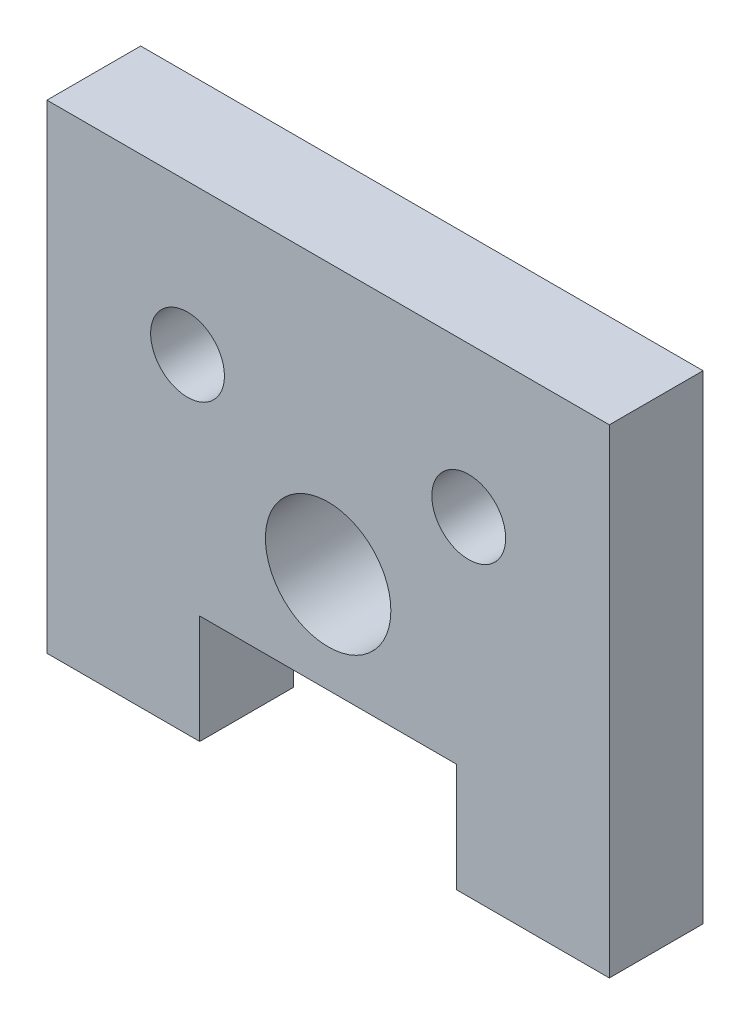
ISO-10303-21;
HEADER;
FILE_DESCRIPTION(('STEP AP214'),'2;1');
FILE_NAME('part.step','',(''),(''),'','','');
FILE_SCHEMA(('AUTOMOTIVE_DESIGN { 1 0 10303 214 1 1 1 1 }'));
ENDSEC;
DATA;
#1=APPLICATION_CONTEXT('core data for automotive mechanical design processes');
#2=APPLICATION_PROTOCOL_DEFINITION('international standard','automotive_design',2000,#1);
#3=PRODUCT_CONTEXT('',#1,'mechanical');
#4=PRODUCT('Part','Part','',(#3));
#5=PRODUCT_RELATED_PRODUCT_CATEGORY('part','',(#4));
#6=PRODUCT_DEFINITION_FORMATION('','',#4);
#7=PRODUCT_DEFINITION_CONTEXT('part definition',#1,'design');
#8=PRODUCT_DEFINITION('design','',#6,#7);
#9=PRODUCT_DEFINITION_SHAPE('','',#8);
#10=(LENGTH_UNIT() NAMED_UNIT(*) SI_UNIT(.MILLI.,.METRE.));
#11=(NAMED_UNIT(*) PLANE_ANGLE_UNIT() SI_UNIT($,.RADIAN.));
#12=(NAMED_UNIT(*) SI_UNIT($,.STERADIAN.) SOLID_ANGLE_UNIT());
#13=UNCERTAINTY_MEASURE_WITH_UNIT(LENGTH_MEASURE(1.E-05),#10,'distance_accuracy_value','');
#14=(GEOMETRIC_REPRESENTATION_CONTEXT(3) GLOBAL_UNCERTAINTY_ASSIGNED_CONTEXT((#13)) GLOBAL_UNIT_ASSIGNED_CONTEXT((#10,
#11,#12)) REPRESENTATION_CONTEXT('',''));
#15=CARTESIAN_POINT('',(0.,0.,0.));
#16=DIRECTION('',(0.,0.,1.));
#17=DIRECTION('',(1.,0.,0.));
#18=AXIS2_PLACEMENT_3D('',#15,#16,#17);
#19=CARTESIAN_POINT('',(-17.399,0.,12.7));
#20=DIRECTION('',(-1.,0.,0.));
#21=DIRECTION('',(0.,-1.,0.));
#22=AXIS2_PLACEMENT_3D('',#19,#20,#21);
#23=PLANE('',#22);
#24=DIRECTION('',(0.,1.,0.));
#25=VECTOR('',#24,1.);
#26=CARTESIAN_POINT('',(-17.399,0.,0.));
#27=LINE('',#26,#25);
#28=CARTESIAN_POINT('',(-17.399,-36.576,0.));
#29=VERTEX_POINT('',#28);
#30=CARTESIAN_POINT('',(-17.399,-21.844,0.));
#31=VERTEX_POINT('',#30);
#32=EDGE_CURVE('E139',#29,#31,#27,.T.);
#33=ORIENTED_EDGE('',*,*,#32,.T.);
#34=DIRECTION('',(0.,0.,-1.));
#35=VECTOR('',#34,1.);
#36=CARTESIAN_POINT('',(-17.399,-21.844,12.7));
#37=LINE('',#36,#35);
#38=CARTESIAN_POINT('',(-17.399,-21.844,12.7));
#39=VERTEX_POINT('',#38);
#40=EDGE_CURVE('E11',#39,#31,#37,.T.);
#41=ORIENTED_EDGE('',*,*,#40,.F.);
#42=DIRECTION('',(0.,1.,0.));
#43=VECTOR('',#42,1.);
#44=CARTESIAN_POINT('',(-17.399,0.,12.7));
#45=LINE('',#44,#43);
#46=CARTESIAN_POINT('',(-17.399,-36.576,12.7));
#47=VERTEX_POINT('',#46);
#48=EDGE_CURVE('E184',#47,#39,#45,.T.);
#49=ORIENTED_EDGE('',*,*,#48,.F.);
#50=DIRECTION('',(0.,0.,-1.));
#51=VECTOR('',#50,1.);
#52=CARTESIAN_POINT('',(-17.399,-36.576,12.7));
#53=LINE('',#52,#51);
#54=EDGE_CURVE('E49',#47,#29,#53,.T.);
#55=ORIENTED_EDGE('',*,*,#54,.T.);
#56=EDGE_LOOP('',(#33,#41,#49,#55));
#57=FACE_BOUND('',#56,.T.);
#58=ADVANCED_FACE('F32',(#57),#23,.F.);
#59=CARTESIAN_POINT('',(0.,-21.844,12.7));
#60=DIRECTION('',(0.,1.,0.));
#61=DIRECTION('',(0.,0.,1.));
#62=AXIS2_PLACEMENT_3D('',#59,#60,#61);
#63=PLANE('',#62);
#64=DIRECTION('',(1.,0.,0.));
#65=VECTOR('',#64,1.);
#66=CARTESIAN_POINT('',(0.,-21.844,0.));
#67=LINE('',#66,#65);
#68=CARTESIAN_POINT('',(17.399,-21.844,0.));
#69=VERTEX_POINT('',#68);
#70=EDGE_CURVE('E141',#31,#69,#67,.T.);
#71=ORIENTED_EDGE('',*,*,#70,.T.);
#72=DIRECTION('',(0.,0.,-1.));
#73=VECTOR('',#72,1.);
#74=CARTESIAN_POINT('',(17.399,-21.844,12.7));
#75=LINE('',#74,#73);
#76=CARTESIAN_POINT('',(17.399,-21.844,12.7));
#77=VERTEX_POINT('',#76);
#78=EDGE_CURVE('E41',#77,#69,#75,.T.);
#79=ORIENTED_EDGE('',*,*,#78,.F.);
#80=DIRECTION('',(1.,0.,0.));
#81=VECTOR('',#80,1.);
#82=CARTESIAN_POINT('',(0.,-21.844,12.7));
#83=LINE('',#82,#81);
#84=EDGE_CURVE('E87',#39,#77,#83,.T.);
#85=ORIENTED_EDGE('',*,*,#84,.F.);
#86=ORIENTED_EDGE('',*,*,#40,.T.);
#87=EDGE_LOOP('',(#71,#79,#85,#86));
#88=FACE_BOUND('',#87,.T.);
#89=ADVANCED_FACE('F220',(#88),#63,.F.);
#90=CARTESIAN_POINT('',(17.399,0.,12.7));
#91=DIRECTION('',(1.,0.,0.));
#92=DIRECTION('',(0.,1.,0.));
#93=AXIS2_PLACEMENT_3D('',#90,#91,#92);
#94=PLANE('',#93);
#95=DIRECTION('',(0.,-1.,0.));
#96=VECTOR('',#95,1.);
#97=CARTESIAN_POINT('',(17.399,0.,0.));
#98=LINE('',#97,#96);
#99=CARTESIAN_POINT('',(17.399,-36.576,0.));
#100=VERTEX_POINT('',#99);
#101=EDGE_CURVE('E143',#69,#100,#98,.T.);
#102=ORIENTED_EDGE('',*,*,#101,.T.);
#103=DIRECTION('',(0.,0.,-1.));
#104=VECTOR('',#103,1.);
#105=CARTESIAN_POINT('',(17.399,-36.576,12.7));
#106=LINE('',#105,#104);
#107=CARTESIAN_POINT('',(17.399,-36.576,12.7));
#108=VERTEX_POINT('',#107);
#109=EDGE_CURVE('E164',#108,#100,#106,.T.);
#110=ORIENTED_EDGE('',*,*,#109,.F.);
#111=DIRECTION('',(0.,-1.,0.));
#112=VECTOR('',#111,1.);
#113=CARTESIAN_POINT('',(17.399,0.,12.7));
#114=LINE('',#113,#112);
#115=EDGE_CURVE('E171',#77,#108,#114,.T.);
#116=ORIENTED_EDGE('',*,*,#115,.F.);
#117=ORIENTED_EDGE('',*,*,#78,.T.);
#118=EDGE_LOOP('',(#102,#110,#116,#117));
#119=FACE_BOUND('',#118,.T.);
#120=ADVANCED_FACE('F169',(#119),#94,.F.);
#121=CARTESIAN_POINT('',(0.,-36.576,12.7));
#122=DIRECTION('',(0.,-1.,0.));
#123=DIRECTION('',(0.,0.,-1.));
#124=AXIS2_PLACEMENT_3D('',#121,#122,#123);
#125=PLANE('',#124);
#126=DIRECTION('',(-1.,0.,0.));
#127=VECTOR('',#126,1.);
#128=CARTESIAN_POINT('',(0.,-36.576,0.));
#129=LINE('',#128,#127);
#130=CARTESIAN_POINT('',(38.1,-36.576,0.));
#131=VERTEX_POINT('',#130);
#132=EDGE_CURVE('E146',#131,#100,#129,.T.);
#133=ORIENTED_EDGE('',*,*,#132,.F.);
#134=DIRECTION('',(0.,0.,-1.));
#135=VECTOR('',#134,1.);
#136=CARTESIAN_POINT('',(38.1,-36.576,12.7));
#137=LINE('',#136,#135);
#138=CARTESIAN_POINT('',(38.1,-36.576,12.7));
#139=VERTEX_POINT('',#138);
#140=EDGE_CURVE('E162',#139,#131,#137,.T.);
#141=ORIENTED_EDGE('',*,*,#140,.F.);
#142=DIRECTION('',(-1.,0.,0.));
#143=VECTOR('',#142,1.);
#144=CARTESIAN_POINT('',(0.,-36.576,12.7));
#145=LINE('',#144,#143);
#146=EDGE_CURVE('E179',#139,#108,#145,.T.);
#147=ORIENTED_EDGE('',*,*,#146,.T.);
#148=ORIENTED_EDGE('',*,*,#109,.T.);
#149=EDGE_LOOP('',(#133,#141,#147,#148));
#150=FACE_BOUND('',#149,.T.);
#151=ADVANCED_FACE('F177',(#150),#125,.T.);
#152=CARTESIAN_POINT('',(38.1,0.,12.7));
#153=DIRECTION('',(-1.,0.,0.));
#154=DIRECTION('',(0.,0.,1.));
#155=AXIS2_PLACEMENT_3D('',#152,#153,#154);
#156=PLANE('',#155);
#157=DIRECTION('',(0.,1.,0.));
#158=VECTOR('',#157,1.);
#159=CARTESIAN_POINT('',(38.1,0.,0.));
#160=LINE('',#159,#158);
#161=CARTESIAN_POINT('',(38.1,28.3363680824292,0.));
#162=VERTEX_POINT('',#161);
#163=EDGE_CURVE('E149',#131,#162,#160,.T.);
#164=ORIENTED_EDGE('',*,*,#163,.T.);
#165=DIRECTION('',(0.,0.,-1.));
#166=VECTOR('',#165,1.);
#167=CARTESIAN_POINT('',(38.1,28.3363680824292,12.7));
#168=LINE('',#167,#166);
#169=CARTESIAN_POINT('',(38.1,28.3363680824292,12.7));
#170=VERTEX_POINT('',#169);
#171=EDGE_CURVE('E112',#170,#162,#168,.T.);
#172=ORIENTED_EDGE('',*,*,#171,.F.);
#173=DIRECTION('',(0.,1.,0.));
#174=VECTOR('',#173,1.);
#175=CARTESIAN_POINT('',(38.1,0.,12.7));
#176=LINE('',#175,#174);
#177=EDGE_CURVE('E121',#139,#170,#176,.T.);
#178=ORIENTED_EDGE('',*,*,#177,.F.);
#179=ORIENTED_EDGE('',*,*,#140,.T.);
#180=EDGE_LOOP('',(#164,#172,#178,#179));
#181=FACE_BOUND('',#180,.T.);
#182=ADVANCED_FACE('F244',(#181),#156,.F.);
#183=CARTESIAN_POINT('',(0.,28.3363680824292,12.7));
#184=DIRECTION('',(0.,1.,0.));
#185=DIRECTION('',(-1.,0.,0.));
#186=AXIS2_PLACEMENT_3D('',#183,#184,#185);
#187=PLANE('',#186);
#188=DIRECTION('',(1.,0.,0.));
#189=VECTOR('',#188,1.);
#190=CARTESIAN_POINT('',(0.,28.3363680824292,0.));
#191=LINE('',#190,#189);
#192=CARTESIAN_POINT('',(-38.1,28.3363680824292,0.));
#193=VERTEX_POINT('',#192);
#194=EDGE_CURVE('E108',#193,#162,#191,.T.);
#195=ORIENTED_EDGE('',*,*,#194,.F.);
#196=DIRECTION('',(0.,0.,-1.));
#197=VECTOR('',#196,1.);
#198=CARTESIAN_POINT('',(-38.1,28.3363680824292,12.7));
#199=LINE('',#198,#197);
#200=CARTESIAN_POINT('',(-38.1,28.3363680824292,12.7));
#201=VERTEX_POINT('',#200);
#202=EDGE_CURVE('E103',#201,#193,#199,.T.);
#203=ORIENTED_EDGE('',*,*,#202,.F.);
#204=DIRECTION('',(1.,0.,0.));
#205=VECTOR('',#204,1.);
#206=CARTESIAN_POINT('',(0.,28.3363680824292,12.7));
#207=LINE('',#206,#205);
#208=EDGE_CURVE('E106',#201,#170,#207,.T.);
#209=ORIENTED_EDGE('',*,*,#208,.T.);
#210=ORIENTED_EDGE('',*,*,#171,.T.);
#211=EDGE_LOOP('',(#195,#203,#209,#210));
#212=FACE_BOUND('',#211,.T.);
#213=ADVANCED_FACE('F105',(#212),#187,.T.);
#214=CARTESIAN_POINT('',(-38.1,0.,12.7));
#215=DIRECTION('',(-1.,0.,0.));
#216=DIRECTION('',(0.,0.,1.));
#217=AXIS2_PLACEMENT_3D('',#214,#215,#216);
#218=PLANE('',#217);
#219=DIRECTION('',(0.,1.,0.));
#220=VECTOR('',#219,1.);
#221=CARTESIAN_POINT('',(-38.1,0.,0.));
#222=LINE('',#221,#220);
#223=CARTESIAN_POINT('',(-38.1,-36.576,0.));
#224=VERTEX_POINT('',#223);
#225=EDGE_CURVE('E153',#224,#193,#222,.T.);
#226=ORIENTED_EDGE('',*,*,#225,.F.);
#227=DIRECTION('',(0.,0.,-1.));
#228=VECTOR('',#227,1.);
#229=CARTESIAN_POINT('',(-38.1,-36.576,12.7));
#230=LINE('',#229,#228);
#231=CARTESIAN_POINT('',(-38.1,-36.576,12.7));
#232=VERTEX_POINT('',#231);
#233=EDGE_CURVE('E75',#232,#224,#230,.T.);
#234=ORIENTED_EDGE('',*,*,#233,.F.);
#235=DIRECTION('',(0.,1.,0.));
#236=VECTOR('',#235,1.);
#237=CARTESIAN_POINT('',(-38.1,0.,12.7));
#238=LINE('',#237,#236);
#239=EDGE_CURVE('E118',#232,#201,#238,.T.);
#240=ORIENTED_EDGE('',*,*,#239,.T.);
#241=ORIENTED_EDGE('',*,*,#202,.T.);
#242=EDGE_LOOP('',(#226,#234,#240,#241));
#243=FACE_BOUND('',#242,.T.);
#244=ADVANCED_FACE('F124',(#243),#218,.T.);
#245=CARTESIAN_POINT('',(-19.05,7.99200000000001,12.7));
#246=DIRECTION('',(0.,0.,-1.));
#247=DIRECTION('',(-1.,0.,0.));
#248=AXIS2_PLACEMENT_3D('',#245,#246,#247);
#249=CYLINDRICAL_SURFACE('',#248,5.);
#250=CARTESIAN_POINT('',(-19.05,7.99200000000001,12.7));
#251=DIRECTION('',(0.,0.,1.));
#252=DIRECTION('',(1.,0.,0.));
#253=AXIS2_PLACEMENT_3D('',#250,#251,#252);
#254=CIRCLE('',#253,5.);
#255=CARTESIAN_POINT('',(-14.05,7.99200000000001,12.7));
#256=VERTEX_POINT('',#255);
#257=EDGE_CURVE('E186',#256,#256,#254,.T.);
#258=ORIENTED_EDGE('',*,*,#257,.T.);
#259=EDGE_LOOP('',(#258));
#260=FACE_BOUND('',#259,.T.);
#261=CARTESIAN_POINT('',(-19.05,7.99200000000001,0.));
#262=DIRECTION('',(0.,0.,1.));
#263=DIRECTION('',(1.,0.,0.));
#264=AXIS2_PLACEMENT_3D('',#261,#262,#263);
#265=CIRCLE('',#264,5.);
#266=CARTESIAN_POINT('',(-14.05,7.99200000000001,0.));
#267=VERTEX_POINT('',#266);
#268=EDGE_CURVE('E136',#267,#267,#265,.T.);
#269=ORIENTED_EDGE('',*,*,#268,.F.);
#270=EDGE_LOOP('',(#269));
#271=FACE_BOUND('',#270,.T.);
#272=ADVANCED_FACE('F205',(#260,#271),#249,.F.);
#273=CARTESIAN_POINT('',(19.05,7.99200000000001,12.7));
#274=DIRECTION('',(0.,0.,-1.));
#275=DIRECTION('',(-1.,0.,0.));
#276=AXIS2_PLACEMENT_3D('',#273,#274,#275);
#277=CYLINDRICAL_SURFACE('',#276,5.);
#278=CARTESIAN_POINT('',(19.05,7.99200000000001,12.7));
#279=DIRECTION('',(0.,0.,1.));
#280=DIRECTION('',(1.,0.,0.));
#281=AXIS2_PLACEMENT_3D('',#278,#279,#280);
#282=CIRCLE('',#281,5.);
#283=CARTESIAN_POINT('',(24.05,7.99200000000001,12.7));
#284=VERTEX_POINT('',#283);
#285=EDGE_CURVE('E189',#284,#284,#282,.T.);
#286=ORIENTED_EDGE('',*,*,#285,.T.);
#287=EDGE_LOOP('',(#286));
#288=FACE_BOUND('',#287,.T.);
#289=CARTESIAN_POINT('',(19.05,7.99200000000001,0.));
#290=DIRECTION('',(0.,0.,1.));
#291=DIRECTION('',(1.,0.,0.));
#292=AXIS2_PLACEMENT_3D('',#289,#290,#291);
#293=CIRCLE('',#292,5.);
#294=CARTESIAN_POINT('',(24.05,7.99200000000001,0.));
#295=VERTEX_POINT('',#294);
#296=EDGE_CURVE('E133',#295,#295,#293,.T.);
#297=ORIENTED_EDGE('',*,*,#296,.F.);
#298=EDGE_LOOP('',(#297));
#299=FACE_BOUND('',#298,.T.);
#300=ADVANCED_FACE('F208',(#288,#299),#277,.F.);
#301=CARTESIAN_POINT('',(0.,-8.26399999999999,12.7));
#302=DIRECTION('',(0.,0.,-1.));
#303=DIRECTION('',(-1.,0.,0.));
#304=AXIS2_PLACEMENT_3D('',#301,#302,#303);
#305=CYLINDRICAL_SURFACE('',#304,8.5);
#306=CARTESIAN_POINT('',(0.,-8.26399999999999,12.7));
#307=DIRECTION('',(0.,0.,1.));
#308=DIRECTION('',(1.,0.,0.));
#309=AXIS2_PLACEMENT_3D('',#306,#307,#308);
#310=CIRCLE('',#309,8.5);
#311=CARTESIAN_POINT('',(8.5,-8.26399999999999,12.7));
#312=VERTEX_POINT('',#311);
#313=EDGE_CURVE('E158',#312,#312,#310,.T.);
#314=ORIENTED_EDGE('',*,*,#313,.T.);
#315=EDGE_LOOP('',(#314));
#316=FACE_BOUND('',#315,.T.);
#317=CARTESIAN_POINT('',(0.,-8.26399999999999,0.));
#318=DIRECTION('',(0.,0.,1.));
#319=DIRECTION('',(1.,0.,0.));
#320=AXIS2_PLACEMENT_3D('',#317,#318,#319);
#321=CIRCLE('',#320,8.5);
#322=CARTESIAN_POINT('',(8.5,-8.26399999999999,0.));
#323=VERTEX_POINT('',#322);
#324=EDGE_CURVE('E130',#323,#323,#321,.T.);
#325=ORIENTED_EDGE('',*,*,#324,.F.);
#326=EDGE_LOOP('',(#325));
#327=FACE_BOUND('',#326,.T.);
#328=ADVANCED_FACE('F34',(#316,#327),#305,.F.);
#329=CARTESIAN_POINT('',(0.,-36.576,12.7));
#330=DIRECTION('',(0.,-1.,0.));
#331=DIRECTION('',(0.,0.,-1.));
#332=AXIS2_PLACEMENT_3D('',#329,#330,#331);
#333=PLANE('',#332);
#334=DIRECTION('',(-1.,0.,0.));
#335=VECTOR('',#334,1.);
#336=CARTESIAN_POINT('',(0.,-36.576,0.));
#337=LINE('',#336,#335);
#338=EDGE_CURVE('E155',#29,#224,#337,.T.);
#339=ORIENTED_EDGE('',*,*,#338,.F.);
#340=ORIENTED_EDGE('',*,*,#54,.F.);
#341=DIRECTION('',(-1.,0.,0.));
#342=VECTOR('',#341,1.);
#343=CARTESIAN_POINT('',(0.,-36.576,12.7));
#344=LINE('',#343,#342);
#345=EDGE_CURVE('E125',#47,#232,#344,.T.);
#346=ORIENTED_EDGE('',*,*,#345,.T.);
#347=ORIENTED_EDGE('',*,*,#233,.T.);
#348=EDGE_LOOP('',(#339,#340,#346,#347));
#349=FACE_BOUND('',#348,.T.);
#350=ADVANCED_FACE('F199',(#349),#333,.T.);
#351=CARTESIAN_POINT('',(0.,0.,12.7));
#352=DIRECTION('',(0.,0.,1.));
#353=DIRECTION('',(1.,0.,0.));
#354=AXIS2_PLACEMENT_3D('',#351,#352,#353);
#355=PLANE('',#354);
#356=ORIENTED_EDGE('',*,*,#313,.F.);
#357=EDGE_LOOP('',(#356));
#358=FACE_BOUND('',#357,.T.);
#359=ORIENTED_EDGE('',*,*,#285,.F.);
#360=EDGE_LOOP('',(#359));
#361=FACE_BOUND('',#360,.T.);
#362=ORIENTED_EDGE('',*,*,#257,.F.);
#363=EDGE_LOOP('',(#362));
#364=FACE_BOUND('',#363,.T.);
#365=ORIENTED_EDGE('',*,*,#48,.T.);
#366=ORIENTED_EDGE('',*,*,#84,.T.);
#367=ORIENTED_EDGE('',*,*,#115,.T.);
#368=ORIENTED_EDGE('',*,*,#146,.F.);
#369=ORIENTED_EDGE('',*,*,#177,.T.);
#370=ORIENTED_EDGE('',*,*,#208,.F.);
#371=ORIENTED_EDGE('',*,*,#239,.F.);
#372=ORIENTED_EDGE('',*,*,#345,.F.);
#373=EDGE_LOOP('',(#365,#366,#367,#368,#369,#370,#371,#372));
#374=FACE_BOUND('',#373,.T.);
#375=ADVANCED_FACE('F116',(#358,#361,#364,#374),#355,.T.);
#376=CARTESIAN_POINT('',(0.,0.,0.));
#377=DIRECTION('',(0.,0.,1.));
#378=DIRECTION('',(1.,0.,0.));
#379=AXIS2_PLACEMENT_3D('',#376,#377,#378);
#380=PLANE('',#379);
#381=ORIENTED_EDGE('',*,*,#324,.T.);
#382=EDGE_LOOP('',(#381));
#383=FACE_BOUND('',#382,.T.);
#384=ORIENTED_EDGE('',*,*,#296,.T.);
#385=EDGE_LOOP('',(#384));
#386=FACE_BOUND('',#385,.T.);
#387=ORIENTED_EDGE('',*,*,#268,.T.);
#388=EDGE_LOOP('',(#387));
#389=FACE_BOUND('',#388,.T.);
#390=ORIENTED_EDGE('',*,*,#32,.F.);
#391=ORIENTED_EDGE('',*,*,#338,.T.);
#392=ORIENTED_EDGE('',*,*,#225,.T.);
#393=ORIENTED_EDGE('',*,*,#194,.T.);
#394=ORIENTED_EDGE('',*,*,#163,.F.);
#395=ORIENTED_EDGE('',*,*,#132,.T.);
#396=ORIENTED_EDGE('',*,*,#101,.F.);
#397=ORIENTED_EDGE('',*,*,#70,.F.);
#398=EDGE_LOOP('',(#390,#391,#392,#393,#394,#395,#396,#397));
#399=FACE_BOUND('',#398,.T.);
#400=ADVANCED_FACE('F173',(#383,#386,#389,#399),#380,.F.);
#401=CLOSED_SHELL('',(#58,#89,#120,#151,#182,#213,#244,#272,#300,#328,#350,#375,#400));
#402=MANIFOLD_SOLID_BREP('B2',#401);
#403=ADVANCED_BREP_SHAPE_REPRESENTATION('',(#18,#402),#14);
#404=SHAPE_DEFINITION_REPRESENTATION(#9,#403);
ENDSEC;
END-ISO-10303-21;
